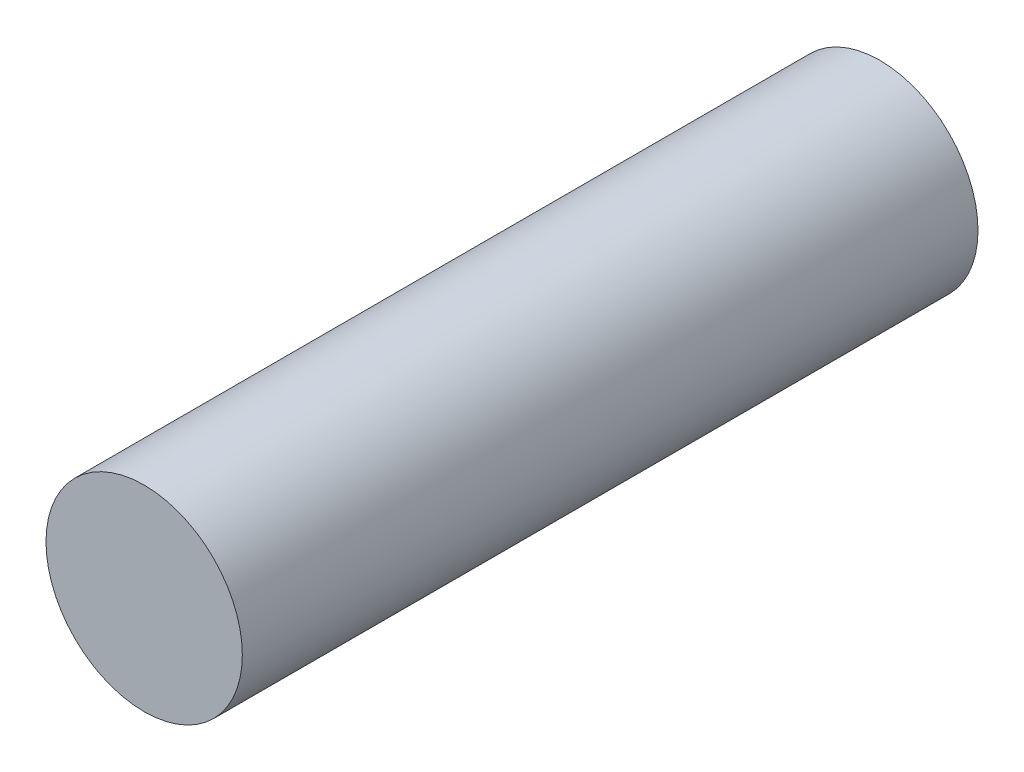
ISO-10303-21;
HEADER;
FILE_DESCRIPTION(('STEP AP214'),'2;1');
FILE_NAME('part.step','',(''),(''),'','','');
FILE_SCHEMA(('AUTOMOTIVE_DESIGN { 1 0 10303 214 1 1 1 1 }'));
ENDSEC;
DATA;
#1=APPLICATION_CONTEXT('core data for automotive mechanical design processes');
#2=APPLICATION_PROTOCOL_DEFINITION('international standard','automotive_design',2000,#1);
#3=PRODUCT_CONTEXT('',#1,'mechanical');
#4=PRODUCT('Part','Part','',(#3));
#5=PRODUCT_RELATED_PRODUCT_CATEGORY('part','',(#4));
#6=PRODUCT_DEFINITION_FORMATION('','',#4);
#7=PRODUCT_DEFINITION_CONTEXT('part definition',#1,'design');
#8=PRODUCT_DEFINITION('design','',#6,#7);
#9=PRODUCT_DEFINITION_SHAPE('','',#8);
#10=(LENGTH_UNIT() NAMED_UNIT(*) SI_UNIT(.MILLI.,.METRE.));
#11=(NAMED_UNIT(*) PLANE_ANGLE_UNIT() SI_UNIT($,.RADIAN.));
#12=(NAMED_UNIT(*) SI_UNIT($,.STERADIAN.) SOLID_ANGLE_UNIT());
#13=UNCERTAINTY_MEASURE_WITH_UNIT(LENGTH_MEASURE(1.E-05),#10,'distance_accuracy_value','');
#14=(GEOMETRIC_REPRESENTATION_CONTEXT(3) GLOBAL_UNCERTAINTY_ASSIGNED_CONTEXT((#13)) GLOBAL_UNIT_ASSIGNED_CONTEXT((#10,
#11,#12)) REPRESENTATION_CONTEXT('',''));
#15=CARTESIAN_POINT('',(0.,0.,0.));
#16=DIRECTION('',(0.,0.,1.));
#17=DIRECTION('',(1.,0.,0.));
#18=AXIS2_PLACEMENT_3D('',#15,#16,#17);
#19=CARTESIAN_POINT('',(0.,0.,381.));
#20=DIRECTION('',(0.,0.,-1.));
#21=DIRECTION('',(-1.,0.,0.));
#22=AXIS2_PLACEMENT_3D('',#19,#20,#21);
#23=CYLINDRICAL_SURFACE('',#22,50.8381);
#24=CARTESIAN_POINT('',(0.,0.,381.));
#25=DIRECTION('',(0.,0.,1.));
#26=DIRECTION('',(1.,0.,0.));
#27=AXIS2_PLACEMENT_3D('',#24,#25,#26);
#28=CIRCLE('',#27,50.8381);
#29=CARTESIAN_POINT('',(50.8381,0.,381.));
#30=VERTEX_POINT('',#29);
#31=EDGE_CURVE('E10',#30,#30,#28,.T.);
#32=ORIENTED_EDGE('',*,*,#31,.F.);
#33=EDGE_LOOP('',(#32));
#34=FACE_BOUND('',#33,.T.);
#35=CARTESIAN_POINT('',(0.,0.,0.));
#36=DIRECTION('',(0.,0.,1.));
#37=DIRECTION('',(1.,0.,0.));
#38=AXIS2_PLACEMENT_3D('',#35,#36,#37);
#39=CIRCLE('',#38,50.8381);
#40=CARTESIAN_POINT('',(50.8381,0.,0.));
#41=VERTEX_POINT('',#40);
#42=EDGE_CURVE('E37',#41,#41,#39,.T.);
#43=ORIENTED_EDGE('',*,*,#42,.T.);
#44=EDGE_LOOP('',(#43));
#45=FACE_BOUND('',#44,.T.);
#46=ADVANCED_FACE('F34',(#34,#45),#23,.T.);
#47=CARTESIAN_POINT('',(0.,0.,381.));
#48=DIRECTION('',(0.,0.,1.));
#49=DIRECTION('',(1.,0.,0.));
#50=AXIS2_PLACEMENT_3D('',#47,#48,#49);
#51=PLANE('',#50);
#52=ORIENTED_EDGE('',*,*,#31,.T.);
#53=EDGE_LOOP('',(#52));
#54=FACE_BOUND('',#53,.T.);
#55=ADVANCED_FACE('F49',(#54),#51,.T.);
#56=CARTESIAN_POINT('',(0.,0.,0.));
#57=DIRECTION('',(0.,0.,1.));
#58=DIRECTION('',(1.,0.,0.));
#59=AXIS2_PLACEMENT_3D('',#56,#57,#58);
#60=PLANE('',#59);
#61=ORIENTED_EDGE('',*,*,#42,.F.);
#62=EDGE_LOOP('',(#61));
#63=FACE_BOUND('',#62,.T.);
#64=ADVANCED_FACE('F47',(#63),#60,.F.);
#65=CLOSED_SHELL('',(#46,#55,#64));
#66=MANIFOLD_SOLID_BREP('B2',#65);
#67=ADVANCED_BREP_SHAPE_REPRESENTATION('',(#18,#66),#14);
#68=SHAPE_DEFINITION_REPRESENTATION(#9,#67);
ENDSEC;
END-ISO-10303-21;
